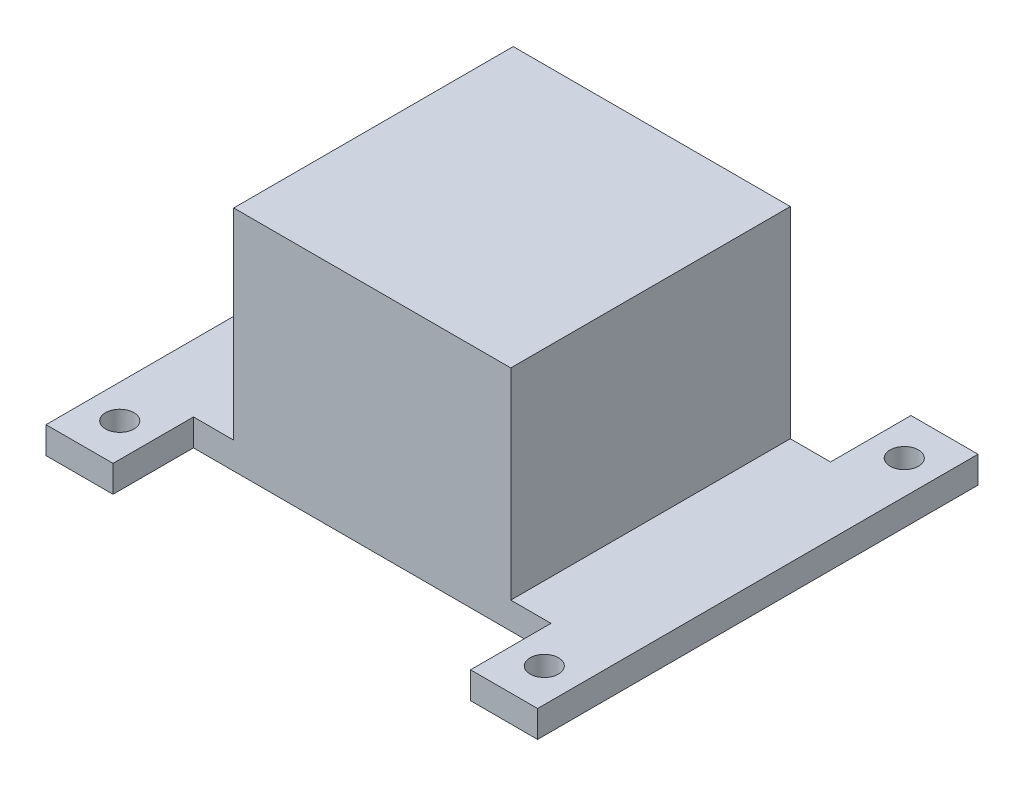
ISO-10303-21;
HEADER;
FILE_DESCRIPTION(('STEP AP214'),'2;1');
FILE_NAME('part.step','',(''),(''),'','','');
FILE_SCHEMA(('AUTOMOTIVE_DESIGN { 1 0 10303 214 1 1 1 1 }'));
ENDSEC;
DATA;
#1=APPLICATION_CONTEXT('core data for automotive mechanical design processes');
#2=APPLICATION_PROTOCOL_DEFINITION('international standard','automotive_design',2000,#1);
#3=PRODUCT_CONTEXT('',#1,'mechanical');
#4=PRODUCT('Part','Part','',(#3));
#5=PRODUCT_RELATED_PRODUCT_CATEGORY('part','',(#4));
#6=PRODUCT_DEFINITION_FORMATION('','',#4);
#7=PRODUCT_DEFINITION_CONTEXT('part definition',#1,'design');
#8=PRODUCT_DEFINITION('design','',#6,#7);
#9=PRODUCT_DEFINITION_SHAPE('','',#8);
#10=(LENGTH_UNIT() NAMED_UNIT(*) SI_UNIT(.MILLI.,.METRE.));
#11=(NAMED_UNIT(*) PLANE_ANGLE_UNIT() SI_UNIT($,.RADIAN.));
#12=(NAMED_UNIT(*) SI_UNIT($,.STERADIAN.) SOLID_ANGLE_UNIT());
#13=UNCERTAINTY_MEASURE_WITH_UNIT(LENGTH_MEASURE(1.E-05),#10,'distance_accuracy_value','');
#14=(GEOMETRIC_REPRESENTATION_CONTEXT(3) GLOBAL_UNCERTAINTY_ASSIGNED_CONTEXT((#13)) GLOBAL_UNIT_ASSIGNED_CONTEXT((#10,
#11,#12)) REPRESENTATION_CONTEXT('',''));
#15=CARTESIAN_POINT('',(0.,0.,0.));
#16=DIRECTION('',(0.,0.,1.));
#17=DIRECTION('',(1.,0.,0.));
#18=AXIS2_PLACEMENT_3D('',#15,#16,#17);
#19=CARTESIAN_POINT('',(0.,6.,0.));
#20=DIRECTION('',(0.,-1.,0.));
#21=DIRECTION('',(0.,0.,-1.));
#22=AXIS2_PLACEMENT_3D('',#19,#20,#21);
#23=PLANE('',#22);
#24=CARTESIAN_POINT('',(0.,6.,-2.725));
#25=DIRECTION('',(0.,1.,0.));
#26=DIRECTION('',(0.,0.,1.));
#27=AXIS2_PLACEMENT_3D('',#24,#25,#26);
#28=CIRCLE('',#27,9.5);
#29=CARTESIAN_POINT('',(0.,6.,6.77499999999999));
#30=VERTEX_POINT('',#29);
#31=EDGE_CURVE('E313',#30,#30,#28,.T.);
#32=ORIENTED_EDGE('',*,*,#31,.F.);
#33=EDGE_LOOP('',(#32));
#34=FACE_BOUND('',#33,.T.);
#35=DIRECTION('',(-1.,0.,0.));
#36=VECTOR('',#35,1.);
#37=CARTESIAN_POINT('',(26.,6.,26.275));
#38=LINE('',#37,#36);
#39=CARTESIAN_POINT('',(26.,6.,26.275));
#40=VERTEX_POINT('',#39);
#41=CARTESIAN_POINT('',(-26.,6.,26.275));
#42=VERTEX_POINT('',#41);
#43=EDGE_CURVE('E172',#40,#42,#38,.T.);
#44=ORIENTED_EDGE('',*,*,#43,.F.);
#45=DIRECTION('',(0.,0.,1.));
#46=VECTOR('',#45,1.);
#47=CARTESIAN_POINT('',(26.,6.,31.275));
#48=LINE('',#47,#46);
#49=CARTESIAN_POINT('',(26.,6.,-31.275));
#50=VERTEX_POINT('',#49);
#51=EDGE_CURVE('E183',#50,#40,#48,.T.);
#52=ORIENTED_EDGE('',*,*,#51,.F.);
#53=DIRECTION('',(-1.,0.,0.));
#54=VECTOR('',#53,1.);
#55=CARTESIAN_POINT('',(-55.,6.,-31.275));
#56=LINE('',#55,#54);
#57=CARTESIAN_POINT('',(-26.,6.,-31.275));
#58=VERTEX_POINT('',#57);
#59=EDGE_CURVE('E326',#50,#58,#56,.T.);
#60=ORIENTED_EDGE('',*,*,#59,.T.);
#61=DIRECTION('',(0.,0.,-1.));
#62=VECTOR('',#61,1.);
#63=CARTESIAN_POINT('',(-26.,6.,31.275));
#64=LINE('',#63,#62);
#65=EDGE_CURVE('E185',#42,#58,#64,.T.);
#66=ORIENTED_EDGE('',*,*,#65,.F.);
#67=EDGE_LOOP('',(#44,#52,#60,#66));
#68=FACE_BOUND('',#67,.T.);
#69=ADVANCED_FACE('F33',(#34,#68),#23,.F.);
#70=CARTESIAN_POINT('',(-26.,46.,31.275));
#71=DIRECTION('',(-1.,0.,0.));
#72=DIRECTION('',(0.,0.,1.));
#73=AXIS2_PLACEMENT_3D('',#70,#71,#72);
#74=PLANE('',#73);
#75=DIRECTION('',(0.,-1.,0.));
#76=VECTOR('',#75,1.);
#77=CARTESIAN_POINT('',(-26.,51.002,26.275));
#78=LINE('',#77,#76);
#79=CARTESIAN_POINT('',(-26.,46.,26.275));
#80=VERTEX_POINT('',#79);
#81=EDGE_CURVE('E50',#80,#42,#78,.T.);
#82=ORIENTED_EDGE('',*,*,#81,.T.);
#83=ORIENTED_EDGE('',*,*,#65,.T.);
#84=DIRECTION('',(0.,-1.,0.));
#85=VECTOR('',#84,1.);
#86=CARTESIAN_POINT('',(-26.,46.,-31.275));
#87=LINE('',#86,#85);
#88=CARTESIAN_POINT('',(-26.,46.,-31.275));
#89=VERTEX_POINT('',#88);
#90=EDGE_CURVE('E211',#89,#58,#87,.T.);
#91=ORIENTED_EDGE('',*,*,#90,.F.);
#92=DIRECTION('',(0.,0.,-1.));
#93=VECTOR('',#92,1.);
#94=CARTESIAN_POINT('',(-26.,46.,31.275));
#95=LINE('',#94,#93);
#96=EDGE_CURVE('E203',#80,#89,#95,.T.);
#97=ORIENTED_EDGE('',*,*,#96,.F.);
#98=EDGE_LOOP('',(#82,#83,#91,#97));
#99=FACE_BOUND('',#98,.T.);
#100=ADVANCED_FACE('F390',(#99),#74,.F.);
#101=CARTESIAN_POINT('',(26.,46.,31.275));
#102=DIRECTION('',(1.,0.,0.));
#103=DIRECTION('',(0.,0.,-1.));
#104=AXIS2_PLACEMENT_3D('',#101,#102,#103);
#105=PLANE('',#104);
#106=DIRECTION('',(0.,-1.,0.));
#107=VECTOR('',#106,1.);
#108=CARTESIAN_POINT('',(26.,51.002,26.275));
#109=LINE('',#108,#107);
#110=CARTESIAN_POINT('',(26.,46.,26.275));
#111=VERTEX_POINT('',#110);
#112=EDGE_CURVE('E169',#111,#40,#109,.T.);
#113=ORIENTED_EDGE('',*,*,#112,.F.);
#114=DIRECTION('',(0.,0.,1.));
#115=VECTOR('',#114,1.);
#116=CARTESIAN_POINT('',(26.,46.,31.275));
#117=LINE('',#116,#115);
#118=CARTESIAN_POINT('',(26.,46.,-31.275));
#119=VERTEX_POINT('',#118);
#120=EDGE_CURVE('E189',#119,#111,#117,.T.);
#121=ORIENTED_EDGE('',*,*,#120,.F.);
#122=DIRECTION('',(0.,-1.,0.));
#123=VECTOR('',#122,1.);
#124=CARTESIAN_POINT('',(26.,46.,-31.275));
#125=LINE('',#124,#123);
#126=EDGE_CURVE('E188',#119,#50,#125,.T.);
#127=ORIENTED_EDGE('',*,*,#126,.T.);
#128=ORIENTED_EDGE('',*,*,#51,.T.);
#129=EDGE_LOOP('',(#113,#121,#127,#128));
#130=FACE_BOUND('',#129,.T.);
#131=ADVANCED_FACE('F187',(#130),#105,.F.);
#132=CARTESIAN_POINT('',(-93.7495219105293,46.,31.275));
#133=DIRECTION('',(0.,-1.,0.));
#134=DIRECTION('',(0.,0.,-1.));
#135=AXIS2_PLACEMENT_3D('',#132,#133,#134);
#136=PLANE('',#135);
#137=ORIENTED_EDGE('',*,*,#120,.T.);
#138=DIRECTION('',(1.,0.,0.));
#139=VECTOR('',#138,1.);
#140=CARTESIAN_POINT('',(26.,46.,26.275));
#141=LINE('',#140,#139);
#142=EDGE_CURVE('E173',#80,#111,#141,.T.);
#143=ORIENTED_EDGE('',*,*,#142,.F.);
#144=ORIENTED_EDGE('',*,*,#96,.T.);
#145=DIRECTION('',(1.,0.,0.));
#146=VECTOR('',#145,1.);
#147=CARTESIAN_POINT('',(-93.7495219105293,46.,-31.275));
#148=LINE('',#147,#146);
#149=EDGE_CURVE('E380',#89,#119,#148,.T.);
#150=ORIENTED_EDGE('',*,*,#149,.T.);
#151=EDGE_LOOP('',(#137,#143,#144,#150));
#152=FACE_BOUND('',#151,.T.);
#153=ADVANCED_FACE('F394',(#152),#136,.T.);
#154=CARTESIAN_POINT('',(47.5,6.,-40.275));
#155=DIRECTION('',(0.,-1.,0.));
#156=DIRECTION('',(0.,0.,1.));
#157=AXIS2_PLACEMENT_3D('',#154,#155,#156);
#158=CIRCLE('',#157,3.175);
#159=CARTESIAN_POINT('',(47.5,6.,-37.1));
#160=VERTEX_POINT('',#159);
#161=EDGE_CURVE('E217',#160,#160,#158,.T.);
#162=ORIENTED_EDGE('',*,*,#161,.T.);
#163=EDGE_LOOP('',(#162));
#164=FACE_BOUND('',#163,.T.);
#165=CARTESIAN_POINT('',(47.5,6.,40.275));
#166=DIRECTION('',(0.,1.,0.));
#167=DIRECTION('',(0.,0.,-1.));
#168=AXIS2_PLACEMENT_3D('',#165,#166,#167);
#169=CIRCLE('',#168,3.175);
#170=CARTESIAN_POINT('',(47.5,6.,37.1));
#171=VERTEX_POINT('',#170);
#172=EDGE_CURVE('E266',#171,#171,#169,.T.);
#173=ORIENTED_EDGE('',*,*,#172,.F.);
#174=EDGE_LOOP('',(#173));
#175=FACE_BOUND('',#174,.T.);
#176=DIRECTION('',(0.,0.,-1.));
#177=VECTOR('',#176,1.);
#178=CARTESIAN_POINT('',(31.,6.,31.275));
#179=LINE('',#178,#177);
#180=CARTESIAN_POINT('',(31.,6.,31.275));
#181=VERTEX_POINT('',#180);
#182=CARTESIAN_POINT('',(31.,6.,-31.275));
#183=VERTEX_POINT('',#182);
#184=EDGE_CURVE('E58',#181,#183,#179,.T.);
#185=ORIENTED_EDGE('',*,*,#184,.F.);
#186=DIRECTION('',(1.,0.,0.));
#187=VECTOR('',#186,1.);
#188=CARTESIAN_POINT('',(-55.,6.,31.275));
#189=LINE('',#188,#187);
#190=CARTESIAN_POINT('',(40.,6.,31.275));
#191=VERTEX_POINT('',#190);
#192=EDGE_CURVE('E42',#181,#191,#189,.T.);
#193=ORIENTED_EDGE('',*,*,#192,.T.);
#194=DIRECTION('',(0.,0.,-1.));
#195=VECTOR('',#194,1.);
#196=CARTESIAN_POINT('',(40.,6.,49.275));
#197=LINE('',#196,#195);
#198=CARTESIAN_POINT('',(40.,6.,49.275));
#199=VERTEX_POINT('',#198);
#200=EDGE_CURVE('E290',#199,#191,#197,.T.);
#201=ORIENTED_EDGE('',*,*,#200,.F.);
#202=DIRECTION('',(-1.,0.,0.));
#203=VECTOR('',#202,1.);
#204=CARTESIAN_POINT('',(55.,6.,49.275));
#205=LINE('',#204,#203);
#206=CARTESIAN_POINT('',(55.,6.,49.275));
#207=VERTEX_POINT('',#206);
#208=EDGE_CURVE('E276',#207,#199,#205,.T.);
#209=ORIENTED_EDGE('',*,*,#208,.F.);
#210=DIRECTION('',(0.,0.,-1.));
#211=VECTOR('',#210,1.);
#212=CARTESIAN_POINT('',(55.,6.,31.275));
#213=LINE('',#212,#211);
#214=CARTESIAN_POINT('',(55.,6.,-49.275));
#215=VERTEX_POINT('',#214);
#216=EDGE_CURVE('E319',#207,#215,#213,.T.);
#217=ORIENTED_EDGE('',*,*,#216,.T.);
#218=DIRECTION('',(-1.,0.,0.));
#219=VECTOR('',#218,1.);
#220=CARTESIAN_POINT('',(55.,6.,-49.275));
#221=LINE('',#220,#219);
#222=CARTESIAN_POINT('',(40.,6.,-49.275));
#223=VERTEX_POINT('',#222);
#224=EDGE_CURVE('E234',#215,#223,#221,.T.);
#225=ORIENTED_EDGE('',*,*,#224,.T.);
#226=DIRECTION('',(0.,0.,1.));
#227=VECTOR('',#226,1.);
#228=CARTESIAN_POINT('',(40.,6.,-49.275));
#229=LINE('',#228,#227);
#230=CARTESIAN_POINT('',(40.,6.,-31.275));
#231=VERTEX_POINT('',#230);
#232=EDGE_CURVE('E237',#223,#231,#229,.T.);
#233=ORIENTED_EDGE('',*,*,#232,.T.);
#234=EDGE_CURVE('E323',#231,#183,#56,.T.);
#235=ORIENTED_EDGE('',*,*,#234,.T.);
#236=EDGE_LOOP('',(#185,#193,#201,#209,#217,#225,#233,#235));
#237=FACE_BOUND('',#236,.T.);
#238=ADVANCED_FACE('F357',(#164,#175,#237),#23,.F.);
#239=CARTESIAN_POINT('',(-47.5,6.,40.275));
#240=DIRECTION('',(0.,1.,0.));
#241=DIRECTION('',(0.,0.,1.));
#242=AXIS2_PLACEMENT_3D('',#239,#240,#241);
#243=CIRCLE('',#242,3.175);
#244=CARTESIAN_POINT('',(-47.5,6.,43.45));
#245=VERTEX_POINT('',#244);
#246=EDGE_CURVE('E267',#245,#245,#243,.T.);
#247=ORIENTED_EDGE('',*,*,#246,.F.);
#248=EDGE_LOOP('',(#247));
#249=FACE_BOUND('',#248,.T.);
#250=CARTESIAN_POINT('',(-47.5,6.,-40.275));
#251=DIRECTION('',(0.,-1.,0.));
#252=DIRECTION('',(0.,0.,-1.));
#253=AXIS2_PLACEMENT_3D('',#250,#251,#252);
#254=CIRCLE('',#253,3.175);
#255=CARTESIAN_POINT('',(-47.5,6.,-43.45));
#256=VERTEX_POINT('',#255);
#257=EDGE_CURVE('E218',#256,#256,#254,.T.);
#258=ORIENTED_EDGE('',*,*,#257,.T.);
#259=EDGE_LOOP('',(#258));
#260=FACE_BOUND('',#259,.T.);
#261=DIRECTION('',(0.,0.,1.));
#262=VECTOR('',#261,1.);
#263=CARTESIAN_POINT('',(-31.,6.,31.275));
#264=LINE('',#263,#262);
#265=CARTESIAN_POINT('',(-31.,6.,-31.275));
#266=VERTEX_POINT('',#265);
#267=CARTESIAN_POINT('',(-31.,6.,31.275));
#268=VERTEX_POINT('',#267);
#269=EDGE_CURVE('E202',#266,#268,#264,.T.);
#270=ORIENTED_EDGE('',*,*,#269,.F.);
#271=CARTESIAN_POINT('',(-40.,6.,-31.275));
#272=VERTEX_POINT('',#271);
#273=EDGE_CURVE('E321',#266,#272,#56,.T.);
#274=ORIENTED_EDGE('',*,*,#273,.T.);
#275=DIRECTION('',(0.,0.,1.));
#276=VECTOR('',#275,1.);
#277=CARTESIAN_POINT('',(-40.,6.,-49.275));
#278=LINE('',#277,#276);
#279=CARTESIAN_POINT('',(-40.,6.,-49.275));
#280=VERTEX_POINT('',#279);
#281=EDGE_CURVE('E263',#280,#272,#278,.T.);
#282=ORIENTED_EDGE('',*,*,#281,.F.);
#283=DIRECTION('',(-1.,0.,0.));
#284=VECTOR('',#283,1.);
#285=CARTESIAN_POINT('',(-55.,6.,-49.275));
#286=LINE('',#285,#284);
#287=CARTESIAN_POINT('',(-55.,6.,-49.275));
#288=VERTEX_POINT('',#287);
#289=EDGE_CURVE('E249',#280,#288,#286,.T.);
#290=ORIENTED_EDGE('',*,*,#289,.T.);
#291=DIRECTION('',(0.,0.,1.));
#292=VECTOR('',#291,1.);
#293=CARTESIAN_POINT('',(-55.,6.,31.275));
#294=LINE('',#293,#292);
#295=CARTESIAN_POINT('',(-55.,6.,49.275));
#296=VERTEX_POINT('',#295);
#297=EDGE_CURVE('E325',#288,#296,#294,.T.);
#298=ORIENTED_EDGE('',*,*,#297,.T.);
#299=DIRECTION('',(-1.,0.,0.));
#300=VECTOR('',#299,1.);
#301=CARTESIAN_POINT('',(-55.,6.,49.275));
#302=LINE('',#301,#300);
#303=CARTESIAN_POINT('',(-40.,6.,49.275));
#304=VERTEX_POINT('',#303);
#305=EDGE_CURVE('E301',#304,#296,#302,.T.);
#306=ORIENTED_EDGE('',*,*,#305,.F.);
#307=DIRECTION('',(0.,0.,-1.));
#308=VECTOR('',#307,1.);
#309=CARTESIAN_POINT('',(-40.,6.,49.275));
#310=LINE('',#309,#308);
#311=CARTESIAN_POINT('',(-40.,6.,31.275));
#312=VERTEX_POINT('',#311);
#313=EDGE_CURVE('E304',#304,#312,#310,.T.);
#314=ORIENTED_EDGE('',*,*,#313,.T.);
#315=EDGE_CURVE('E11',#312,#268,#189,.T.);
#316=ORIENTED_EDGE('',*,*,#315,.T.);
#317=EDGE_LOOP('',(#270,#274,#282,#290,#298,#306,#314,#316));
#318=FACE_BOUND('',#317,.T.);
#319=ADVANCED_FACE('F353',(#249,#260,#318),#23,.F.);
#320=CARTESIAN_POINT('',(-55.,6.,31.275));
#321=DIRECTION('',(0.,0.,-1.));
#322=DIRECTION('',(-1.,0.,0.));
#323=AXIS2_PLACEMENT_3D('',#320,#321,#322);
#324=PLANE('',#323);
#325=DIRECTION('',(0.,-1.,0.));
#326=VECTOR('',#325,1.);
#327=CARTESIAN_POINT('',(40.,0.,31.275));
#328=LINE('',#327,#326);
#329=CARTESIAN_POINT('',(40.,0.,31.275));
#330=VERTEX_POINT('',#329);
#331=EDGE_CURVE('E277',#191,#330,#328,.T.);
#332=ORIENTED_EDGE('',*,*,#331,.F.);
#333=ORIENTED_EDGE('',*,*,#192,.F.);
#334=DIRECTION('',(0.,-1.,0.));
#335=VECTOR('',#334,1.);
#336=CARTESIAN_POINT('',(31.,46.,31.275));
#337=LINE('',#336,#335);
#338=CARTESIAN_POINT('',(31.,51.,31.275));
#339=VERTEX_POINT('',#338);
#340=EDGE_CURVE('E191',#339,#181,#337,.T.);
#341=ORIENTED_EDGE('',*,*,#340,.F.);
#342=DIRECTION('',(1.,0.,0.));
#343=VECTOR('',#342,1.);
#344=CARTESIAN_POINT('',(-93.7495219105293,51.,31.275));
#345=LINE('',#344,#343);
#346=CARTESIAN_POINT('',(-31.,51.,31.275));
#347=VERTEX_POINT('',#346);
#348=EDGE_CURVE('E373',#347,#339,#345,.T.);
#349=ORIENTED_EDGE('',*,*,#348,.F.);
#350=DIRECTION('',(0.,-1.,0.));
#351=VECTOR('',#350,1.);
#352=CARTESIAN_POINT('',(-31.,46.,31.275));
#353=LINE('',#352,#351);
#354=EDGE_CURVE('E214',#347,#268,#353,.T.);
#355=ORIENTED_EDGE('',*,*,#354,.T.);
#356=ORIENTED_EDGE('',*,*,#315,.F.);
#357=DIRECTION('',(0.,1.,0.));
#358=VECTOR('',#357,1.);
#359=CARTESIAN_POINT('',(-40.,0.,31.275));
#360=LINE('',#359,#358);
#361=CARTESIAN_POINT('',(-40.,0.,31.275));
#362=VERTEX_POINT('',#361);
#363=EDGE_CURVE('E293',#362,#312,#360,.T.);
#364=ORIENTED_EDGE('',*,*,#363,.F.);
#365=DIRECTION('',(1.,0.,0.));
#366=VECTOR('',#365,1.);
#367=CARTESIAN_POINT('',(-55.,0.,31.275));
#368=LINE('',#367,#366);
#369=EDGE_CURVE('E322',#362,#330,#368,.T.);
#370=ORIENTED_EDGE('',*,*,#369,.T.);
#371=EDGE_LOOP('',(#332,#333,#341,#349,#355,#356,#364,#370));
#372=FACE_BOUND('',#371,.T.);
#373=ADVANCED_FACE('F356',(#372),#324,.F.);
#374=CARTESIAN_POINT('',(55.,6.,31.275));
#375=DIRECTION('',(-1.,0.,0.));
#376=DIRECTION('',(0.,0.,1.));
#377=AXIS2_PLACEMENT_3D('',#374,#375,#376);
#378=PLANE('',#377);
#379=DIRECTION('',(0.,0.,-1.));
#380=VECTOR('',#379,1.);
#381=CARTESIAN_POINT('',(55.,0.,31.275));
#382=LINE('',#381,#380);
#383=CARTESIAN_POINT('',(55.,0.,49.275));
#384=VERTEX_POINT('',#383);
#385=CARTESIAN_POINT('',(55.,0.,-49.275));
#386=VERTEX_POINT('',#385);
#387=EDGE_CURVE('E316',#384,#386,#382,.T.);
#388=ORIENTED_EDGE('',*,*,#387,.T.);
#389=DIRECTION('',(0.,1.,0.));
#390=VECTOR('',#389,1.);
#391=CARTESIAN_POINT('',(55.,0.,-49.275));
#392=LINE('',#391,#390);
#393=EDGE_CURVE('E224',#386,#215,#392,.T.);
#394=ORIENTED_EDGE('',*,*,#393,.T.);
#395=ORIENTED_EDGE('',*,*,#216,.F.);
#396=DIRECTION('',(0.,1.,0.));
#397=VECTOR('',#396,1.);
#398=CARTESIAN_POINT('',(55.,0.,49.275));
#399=LINE('',#398,#397);
#400=EDGE_CURVE('E273',#384,#207,#399,.T.);
#401=ORIENTED_EDGE('',*,*,#400,.F.);
#402=EDGE_LOOP('',(#388,#394,#395,#401));
#403=FACE_BOUND('',#402,.T.);
#404=ADVANCED_FACE('F35',(#403),#378,.F.);
#405=CARTESIAN_POINT('',(-55.,6.,-31.275));
#406=DIRECTION('',(0.,0.,1.));
#407=DIRECTION('',(1.,0.,0.));
#408=AXIS2_PLACEMENT_3D('',#405,#406,#407);
#409=PLANE('',#408);
#410=DIRECTION('',(0.,-1.,0.));
#411=VECTOR('',#410,1.);
#412=CARTESIAN_POINT('',(-31.,46.,-31.275));
#413=LINE('',#412,#411);
#414=CARTESIAN_POINT('',(-31.,51.,-31.275));
#415=VERTEX_POINT('',#414);
#416=EDGE_CURVE('E205',#415,#266,#413,.T.);
#417=ORIENTED_EDGE('',*,*,#416,.F.);
#418=DIRECTION('',(1.,0.,0.));
#419=VECTOR('',#418,1.);
#420=CARTESIAN_POINT('',(-93.7495219105293,51.,-31.275));
#421=LINE('',#420,#419);
#422=CARTESIAN_POINT('',(31.,51.,-31.275));
#423=VERTEX_POINT('',#422);
#424=EDGE_CURVE('E376',#415,#423,#421,.T.);
#425=ORIENTED_EDGE('',*,*,#424,.T.);
#426=DIRECTION('',(0.,-1.,0.));
#427=VECTOR('',#426,1.);
#428=CARTESIAN_POINT('',(31.,46.,-31.275));
#429=LINE('',#428,#427);
#430=EDGE_CURVE('E199',#423,#183,#429,.T.);
#431=ORIENTED_EDGE('',*,*,#430,.T.);
#432=ORIENTED_EDGE('',*,*,#234,.F.);
#433=DIRECTION('',(0.,-1.,0.));
#434=VECTOR('',#433,1.);
#435=CARTESIAN_POINT('',(40.,0.,-31.275));
#436=LINE('',#435,#434);
#437=CARTESIAN_POINT('',(40.,0.,-31.275));
#438=VERTEX_POINT('',#437);
#439=EDGE_CURVE('E228',#231,#438,#436,.T.);
#440=ORIENTED_EDGE('',*,*,#439,.T.);
#441=DIRECTION('',(-1.,0.,0.));
#442=VECTOR('',#441,1.);
#443=CARTESIAN_POINT('',(-55.,0.,-31.275));
#444=LINE('',#443,#442);
#445=CARTESIAN_POINT('',(-40.,0.,-31.275));
#446=VERTEX_POINT('',#445);
#447=EDGE_CURVE('E329',#438,#446,#444,.T.);
#448=ORIENTED_EDGE('',*,*,#447,.T.);
#449=DIRECTION('',(0.,1.,0.));
#450=VECTOR('',#449,1.);
#451=CARTESIAN_POINT('',(-40.,0.,-31.275));
#452=LINE('',#451,#450);
#453=EDGE_CURVE('E245',#446,#272,#452,.T.);
#454=ORIENTED_EDGE('',*,*,#453,.T.);
#455=ORIENTED_EDGE('',*,*,#273,.F.);
#456=EDGE_LOOP('',(#417,#425,#431,#432,#440,#448,#454,#455));
#457=FACE_BOUND('',#456,.T.);
#458=ORIENTED_EDGE('',*,*,#149,.F.);
#459=ORIENTED_EDGE('',*,*,#90,.T.);
#460=ORIENTED_EDGE('',*,*,#59,.F.);
#461=ORIENTED_EDGE('',*,*,#126,.F.);
#462=EDGE_LOOP('',(#458,#459,#460,#461));
#463=FACE_BOUND('',#462,.T.);
#464=ADVANCED_FACE('F363',(#457,#463),#409,.F.);
#465=CARTESIAN_POINT('',(-55.,6.,31.275));
#466=DIRECTION('',(1.,0.,0.));
#467=DIRECTION('',(0.,0.,-1.));
#468=AXIS2_PLACEMENT_3D('',#465,#466,#467);
#469=PLANE('',#468);
#470=DIRECTION('',(0.,0.,1.));
#471=VECTOR('',#470,1.);
#472=CARTESIAN_POINT('',(-55.,0.,31.275));
#473=LINE('',#472,#471);
#474=CARTESIAN_POINT('',(-55.,0.,-49.275));
#475=VERTEX_POINT('',#474);
#476=CARTESIAN_POINT('',(-55.,0.,49.275));
#477=VERTEX_POINT('',#476);
#478=EDGE_CURVE('E331',#475,#477,#473,.T.);
#479=ORIENTED_EDGE('',*,*,#478,.T.);
#480=DIRECTION('',(0.,-1.,0.));
#481=VECTOR('',#480,1.);
#482=CARTESIAN_POINT('',(-55.,0.,49.275));
#483=LINE('',#482,#481);
#484=EDGE_CURVE('E294',#296,#477,#483,.T.);
#485=ORIENTED_EDGE('',*,*,#484,.F.);
#486=ORIENTED_EDGE('',*,*,#297,.F.);
#487=DIRECTION('',(0.,-1.,0.));
#488=VECTOR('',#487,1.);
#489=CARTESIAN_POINT('',(-55.,0.,-49.275));
#490=LINE('',#489,#488);
#491=EDGE_CURVE('E246',#288,#475,#490,.T.);
#492=ORIENTED_EDGE('',*,*,#491,.T.);
#493=EDGE_LOOP('',(#479,#485,#486,#492));
#494=FACE_BOUND('',#493,.T.);
#495=ADVANCED_FACE('F396',(#494),#469,.F.);
#496=CARTESIAN_POINT('',(0.,0.,0.));
#497=DIRECTION('',(0.,-1.,0.));
#498=DIRECTION('',(0.,0.,-1.));
#499=AXIS2_PLACEMENT_3D('',#496,#497,#498);
#500=PLANE('',#499);
#501=CARTESIAN_POINT('',(-47.5,0.,-40.275));
#502=DIRECTION('',(0.,-1.,0.));
#503=DIRECTION('',(0.,0.,-1.));
#504=AXIS2_PLACEMENT_3D('',#501,#502,#503);
#505=CIRCLE('',#504,3.175);
#506=CARTESIAN_POINT('',(-47.5,0.,-43.45));
#507=VERTEX_POINT('',#506);
#508=EDGE_CURVE('E37',#507,#507,#505,.F.);
#509=ORIENTED_EDGE('',*,*,#508,.T.);
#510=EDGE_LOOP('',(#509));
#511=FACE_BOUND('',#510,.T.);
#512=CARTESIAN_POINT('',(47.5,0.,-40.275));
#513=DIRECTION('',(0.,-1.,0.));
#514=DIRECTION('',(0.,0.,-1.));
#515=AXIS2_PLACEMENT_3D('',#512,#513,#514);
#516=CIRCLE('',#515,3.175);
#517=CARTESIAN_POINT('',(47.5,0.,-43.45));
#518=VERTEX_POINT('',#517);
#519=EDGE_CURVE('E221',#518,#518,#516,.F.);
#520=ORIENTED_EDGE('',*,*,#519,.T.);
#521=EDGE_LOOP('',(#520));
#522=FACE_BOUND('',#521,.T.);
#523=CARTESIAN_POINT('',(-47.5,0.,40.275));
#524=DIRECTION('',(0.,-1.,0.));
#525=DIRECTION('',(0.,0.,-1.));
#526=AXIS2_PLACEMENT_3D('',#523,#524,#525);
#527=CIRCLE('',#526,3.175);
#528=CARTESIAN_POINT('',(-47.5,0.,37.1));
#529=VERTEX_POINT('',#528);
#530=EDGE_CURVE('E287',#529,#529,#527,.T.);
#531=ORIENTED_EDGE('',*,*,#530,.F.);
#532=EDGE_LOOP('',(#531));
#533=FACE_BOUND('',#532,.T.);
#534=CARTESIAN_POINT('',(47.5,0.,40.275));
#535=DIRECTION('',(0.,-1.,0.));
#536=DIRECTION('',(0.,0.,-1.));
#537=AXIS2_PLACEMENT_3D('',#534,#535,#536);
#538=CIRCLE('',#537,3.175);
#539=CARTESIAN_POINT('',(47.5,0.,37.1));
#540=VERTEX_POINT('',#539);
#541=EDGE_CURVE('E270',#540,#540,#538,.T.);
#542=ORIENTED_EDGE('',*,*,#541,.F.);
#543=EDGE_LOOP('',(#542));
#544=FACE_BOUND('',#543,.T.);
#545=CARTESIAN_POINT('',(0.,0.,-2.725));
#546=DIRECTION('',(0.,-1.,0.));
#547=DIRECTION('',(0.,0.,-1.));
#548=AXIS2_PLACEMENT_3D('',#545,#546,#547);
#549=CIRCLE('',#548,9.5);
#550=CARTESIAN_POINT('',(0.,0.,6.77499999999999));
#551=VERTEX_POINT('',#550);
#552=EDGE_CURVE('E312',#551,#551,#549,.F.);
#553=ORIENTED_EDGE('',*,*,#552,.T.);
#554=EDGE_LOOP('',(#553));
#555=FACE_BOUND('',#554,.T.);
#556=ORIENTED_EDGE('',*,*,#387,.F.);
#557=DIRECTION('',(1.,0.,0.));
#558=VECTOR('',#557,1.);
#559=CARTESIAN_POINT('',(55.,0.,49.275));
#560=LINE('',#559,#558);
#561=CARTESIAN_POINT('',(40.,0.,49.275));
#562=VERTEX_POINT('',#561);
#563=EDGE_CURVE('E281',#562,#384,#560,.T.);
#564=ORIENTED_EDGE('',*,*,#563,.F.);
#565=DIRECTION('',(0.,0.,-1.));
#566=VECTOR('',#565,1.);
#567=CARTESIAN_POINT('',(40.,0.,49.275));
#568=LINE('',#567,#566);
#569=EDGE_CURVE('E284',#562,#330,#568,.T.);
#570=ORIENTED_EDGE('',*,*,#569,.T.);
#571=ORIENTED_EDGE('',*,*,#369,.F.);
#572=DIRECTION('',(0.,0.,-1.));
#573=VECTOR('',#572,1.);
#574=CARTESIAN_POINT('',(-40.,0.,49.275));
#575=LINE('',#574,#573);
#576=CARTESIAN_POINT('',(-40.,0.,49.275));
#577=VERTEX_POINT('',#576);
#578=EDGE_CURVE('E309',#577,#362,#575,.T.);
#579=ORIENTED_EDGE('',*,*,#578,.F.);
#580=DIRECTION('',(1.,0.,0.));
#581=VECTOR('',#580,1.);
#582=CARTESIAN_POINT('',(-55.,0.,49.275));
#583=LINE('',#582,#581);
#584=EDGE_CURVE('E297',#477,#577,#583,.T.);
#585=ORIENTED_EDGE('',*,*,#584,.F.);
#586=ORIENTED_EDGE('',*,*,#478,.F.);
#587=DIRECTION('',(1.,0.,0.));
#588=VECTOR('',#587,1.);
#589=CARTESIAN_POINT('',(-55.,0.,-49.275));
#590=LINE('',#589,#588);
#591=CARTESIAN_POINT('',(-40.,0.,-49.275));
#592=VERTEX_POINT('',#591);
#593=EDGE_CURVE('E255',#475,#592,#590,.T.);
#594=ORIENTED_EDGE('',*,*,#593,.T.);
#595=DIRECTION('',(0.,0.,1.));
#596=VECTOR('',#595,1.);
#597=CARTESIAN_POINT('',(-40.,0.,-49.275));
#598=LINE('',#597,#596);
#599=EDGE_CURVE('E258',#592,#446,#598,.T.);
#600=ORIENTED_EDGE('',*,*,#599,.T.);
#601=ORIENTED_EDGE('',*,*,#447,.F.);
#602=DIRECTION('',(0.,0.,1.));
#603=VECTOR('',#602,1.);
#604=CARTESIAN_POINT('',(40.,0.,-49.275));
#605=LINE('',#604,#603);
#606=CARTESIAN_POINT('',(40.,0.,-49.275));
#607=VERTEX_POINT('',#606);
#608=EDGE_CURVE('E242',#607,#438,#605,.T.);
#609=ORIENTED_EDGE('',*,*,#608,.F.);
#610=DIRECTION('',(1.,0.,0.));
#611=VECTOR('',#610,1.);
#612=CARTESIAN_POINT('',(55.,0.,-49.275));
#613=LINE('',#612,#611);
#614=EDGE_CURVE('E227',#607,#386,#613,.T.);
#615=ORIENTED_EDGE('',*,*,#614,.T.);
#616=EDGE_LOOP('',(#556,#564,#570,#571,#579,#585,#586,#594,#600,#601,#609,#615));
#617=FACE_BOUND('',#616,.T.);
#618=ADVANCED_FACE('F343',(#511,#522,#533,#544,#555,#617),#500,.T.);
#619=CARTESIAN_POINT('',(0.,-0.00100000000000013,-2.725));
#620=DIRECTION('',(0.,1.,0.));
#621=DIRECTION('',(0.,0.,1.));
#622=AXIS2_PLACEMENT_3D('',#619,#620,#621);
#623=CYLINDRICAL_SURFACE('',#622,9.5);
#624=CARTESIAN_POINT('',(0.,0.,6.77499999999999));
#625=CARTESIAN_POINT('',(0.,0.0624999999999999,6.77499999999999));
#626=CARTESIAN_POINT('',(0.,0.125,6.77499999999999));
#627=CARTESIAN_POINT('',(0.,0.25,6.77499999999999));
#628=CARTESIAN_POINT('',(0.,0.3125,6.77499999999999));
#629=CARTESIAN_POINT('',(0.,0.4375,6.77499999999999));
#630=CARTESIAN_POINT('',(0.,0.5,6.77499999999999));
#631=CARTESIAN_POINT('',(0.,0.625,6.77499999999999));
#632=CARTESIAN_POINT('',(0.,0.6875,6.77499999999999));
#633=CARTESIAN_POINT('',(0.,0.8125,6.77499999999999));
#634=CARTESIAN_POINT('',(0.,0.875,6.77499999999999));
#635=CARTESIAN_POINT('',(0.,1.,6.77499999999999));
#636=CARTESIAN_POINT('',(0.,1.0625,6.77499999999999));
#637=CARTESIAN_POINT('',(0.,1.1875,6.77499999999999));
#638=CARTESIAN_POINT('',(0.,1.25,6.77499999999999));
#639=CARTESIAN_POINT('',(0.,1.375,6.77499999999999));
#640=CARTESIAN_POINT('',(0.,1.4375,6.77499999999999));
#641=CARTESIAN_POINT('',(0.,1.5625,6.77499999999999));
#642=CARTESIAN_POINT('',(0.,1.625,6.77499999999999));
#643=CARTESIAN_POINT('',(0.,1.75,6.77499999999999));
#644=CARTESIAN_POINT('',(0.,1.8125,6.77499999999999));
#645=CARTESIAN_POINT('',(0.,1.9375,6.77499999999999));
#646=CARTESIAN_POINT('',(0.,2.,6.77499999999999));
#647=CARTESIAN_POINT('',(0.,2.125,6.77499999999999));
#648=CARTESIAN_POINT('',(0.,2.1875,6.77499999999999));
#649=CARTESIAN_POINT('',(0.,2.3125,6.77499999999999));
#650=CARTESIAN_POINT('',(0.,2.375,6.77499999999999));
#651=CARTESIAN_POINT('',(0.,2.5,6.77499999999999));
#652=CARTESIAN_POINT('',(0.,2.5625,6.77499999999999));
#653=CARTESIAN_POINT('',(0.,2.6875,6.77499999999999));
#654=CARTESIAN_POINT('',(0.,2.75,6.77499999999999));
#655=CARTESIAN_POINT('',(0.,2.875,6.77499999999999));
#656=CARTESIAN_POINT('',(0.,2.9375,6.77499999999999));
#657=CARTESIAN_POINT('',(0.,3.0625,6.77499999999999));
#658=CARTESIAN_POINT('',(0.,3.125,6.77499999999999));
#659=CARTESIAN_POINT('',(0.,3.25,6.77499999999999));
#660=CARTESIAN_POINT('',(0.,3.3125,6.77499999999999));
#661=CARTESIAN_POINT('',(0.,3.4375,6.77499999999999));
#662=CARTESIAN_POINT('',(0.,3.5,6.77499999999999));
#663=CARTESIAN_POINT('',(0.,3.625,6.77499999999999));
#664=CARTESIAN_POINT('',(0.,3.6875,6.77499999999999));
#665=CARTESIAN_POINT('',(0.,3.8125,6.77499999999999));
#666=CARTESIAN_POINT('',(0.,3.875,6.77499999999999));
#667=CARTESIAN_POINT('',(0.,4.,6.77499999999999));
#668=CARTESIAN_POINT('',(0.,4.0625,6.77499999999999));
#669=CARTESIAN_POINT('',(0.,4.1875,6.77499999999999));
#670=CARTESIAN_POINT('',(0.,4.25,6.77499999999999));
#671=CARTESIAN_POINT('',(0.,4.375,6.77499999999999));
#672=CARTESIAN_POINT('',(0.,4.4375,6.77499999999999));
#673=CARTESIAN_POINT('',(0.,4.5625,6.77499999999999));
#674=CARTESIAN_POINT('',(0.,4.625,6.77499999999999));
#675=CARTESIAN_POINT('',(0.,4.75,6.77499999999999));
#676=CARTESIAN_POINT('',(0.,4.8125,6.77499999999999));
#677=CARTESIAN_POINT('',(0.,4.9375,6.77499999999999));
#678=CARTESIAN_POINT('',(0.,5.,6.77499999999999));
#679=CARTESIAN_POINT('',(0.,5.125,6.77499999999999));
#680=CARTESIAN_POINT('',(0.,5.1875,6.77499999999999));
#681=CARTESIAN_POINT('',(0.,5.3125,6.77499999999999));
#682=CARTESIAN_POINT('',(0.,5.375,6.77499999999999));
#683=CARTESIAN_POINT('',(0.,5.5,6.77499999999999));
#684=CARTESIAN_POINT('',(0.,5.5625,6.77499999999999));
#685=CARTESIAN_POINT('',(0.,5.6875,6.77499999999999));
#686=CARTESIAN_POINT('',(0.,5.75,6.77499999999999));
#687=CARTESIAN_POINT('',(0.,5.875,6.77499999999999));
#688=CARTESIAN_POINT('',(0.,5.9375,6.77499999999999));
#689=CARTESIAN_POINT('',(0.,6.,6.77499999999999));
#690=B_SPLINE_CURVE_WITH_KNOTS('',3,(#624,#625,#626,#627,#628,#629,#630,#631,#632,#633,#634,
#635,#636,#637,#638,#639,#640,#641,#642,#643,#644,#645,#646,#647,#648,#649,#650,#651,#652,#653,
#654,#655,#656,#657,#658,#659,#660,#661,#662,#663,#664,#665,#666,#667,#668,#669,#670,#671,#672,
#673,#674,#675,#676,#677,#678,#679,#680,#681,#682,#683,#684,#685,#686,#687,#688,#689),
.UNSPECIFIED.,.F.,.F.,(4,2,2,2,2,2,2,2,2,2,2,2,2,2,2,2,2,2,2,2,2,2,2,2,2,2,2,2,2,2,2,2,4),(0.,
0.1875,0.375,0.5625,0.75,0.9375,1.125,1.3125,1.5,1.6875,1.875,2.0625,2.25,2.4375,2.625,2.8125,
3.,3.1875,3.375,3.5625,3.75,3.9375,4.125,4.3125,4.5,4.6875,4.875,5.0625,5.25,5.4375,5.625,
5.8125,6.),.UNSPECIFIED.);
#691=EDGE_CURVE('BSEAM450',#551,#30,#690,.T.);
#692=ORIENTED_EDGE('',*,*,#552,.F.);
#693=ORIENTED_EDGE('',*,*,#31,.T.);
#694=ORIENTED_EDGE('',*,*,#691,.T.);
#695=ORIENTED_EDGE('',*,*,#691,.F.);
#696=EDGE_LOOP('',(#692,#694,#693,#695));
#697=FACE_BOUND('',#696,.T.);
#698=ADVANCED_FACE('F450',(#697),#623,.F.);
#699=CARTESIAN_POINT('',(-40.,0.,49.275));
#700=DIRECTION('',(-1.,0.,0.));
#701=DIRECTION('',(0.,0.,1.));
#702=AXIS2_PLACEMENT_3D('',#699,#700,#701);
#703=PLANE('',#702);
#704=ORIENTED_EDGE('',*,*,#363,.T.);
#705=ORIENTED_EDGE('',*,*,#313,.F.);
#706=DIRECTION('',(0.,1.,0.));
#707=VECTOR('',#706,1.);
#708=CARTESIAN_POINT('',(-40.,0.,49.275));
#709=LINE('',#708,#707);
#710=EDGE_CURVE('E299',#577,#304,#709,.T.);
#711=ORIENTED_EDGE('',*,*,#710,.F.);
#712=ORIENTED_EDGE('',*,*,#578,.T.);
#713=EDGE_LOOP('',(#704,#705,#711,#712));
#714=FACE_BOUND('',#713,.T.);
#715=ADVANCED_FACE('F447',(#714),#703,.F.);
#716=CARTESIAN_POINT('',(0.,0.,49.275));
#717=DIRECTION('',(0.,0.,-1.));
#718=DIRECTION('',(-1.,0.,0.));
#719=AXIS2_PLACEMENT_3D('',#716,#717,#718);
#720=PLANE('',#719);
#721=ORIENTED_EDGE('',*,*,#484,.T.);
#722=ORIENTED_EDGE('',*,*,#584,.T.);
#723=ORIENTED_EDGE('',*,*,#710,.T.);
#724=ORIENTED_EDGE('',*,*,#305,.T.);
#725=EDGE_LOOP('',(#721,#722,#723,#724));
#726=FACE_BOUND('',#725,.T.);
#727=ADVANCED_FACE('F443',(#726),#720,.F.);
#728=CARTESIAN_POINT('',(40.,0.,49.275));
#729=DIRECTION('',(1.,0.,0.));
#730=DIRECTION('',(0.,0.,-1.));
#731=AXIS2_PLACEMENT_3D('',#728,#729,#730);
#732=PLANE('',#731);
#733=ORIENTED_EDGE('',*,*,#331,.T.);
#734=ORIENTED_EDGE('',*,*,#569,.F.);
#735=DIRECTION('',(0.,-1.,0.));
#736=VECTOR('',#735,1.);
#737=CARTESIAN_POINT('',(40.,0.,49.275));
#738=LINE('',#737,#736);
#739=EDGE_CURVE('E279',#199,#562,#738,.T.);
#740=ORIENTED_EDGE('',*,*,#739,.F.);
#741=ORIENTED_EDGE('',*,*,#200,.T.);
#742=EDGE_LOOP('',(#733,#734,#740,#741));
#743=FACE_BOUND('',#742,.T.);
#744=ADVANCED_FACE('F436',(#743),#732,.F.);
#745=CARTESIAN_POINT('',(0.,0.,49.275));
#746=DIRECTION('',(0.,0.,1.));
#747=DIRECTION('',(1.,0.,0.));
#748=AXIS2_PLACEMENT_3D('',#745,#746,#747);
#749=PLANE('',#748);
#750=ORIENTED_EDGE('',*,*,#400,.T.);
#751=ORIENTED_EDGE('',*,*,#208,.T.);
#752=ORIENTED_EDGE('',*,*,#739,.T.);
#753=ORIENTED_EDGE('',*,*,#563,.T.);
#754=EDGE_LOOP('',(#750,#751,#752,#753));
#755=FACE_BOUND('',#754,.T.);
#756=ADVANCED_FACE('F426',(#755),#749,.T.);
#757=CARTESIAN_POINT('',(47.5,-12.,40.275));
#758=DIRECTION('',(0.,1.,0.));
#759=DIRECTION('',(0.,0.,1.));
#760=AXIS2_PLACEMENT_3D('',#757,#758,#759);
#761=CYLINDRICAL_SURFACE('',#760,3.175);
#762=ORIENTED_EDGE('',*,*,#541,.T.);
#763=EDGE_LOOP('',(#762));
#764=FACE_BOUND('',#763,.T.);
#765=ORIENTED_EDGE('',*,*,#172,.T.);
#766=EDGE_LOOP('',(#765));
#767=FACE_BOUND('',#766,.T.);
#768=ADVANCED_FACE('F423',(#764,#767),#761,.F.);
#769=CARTESIAN_POINT('',(-47.5,-12.,40.275));
#770=DIRECTION('',(0.,1.,0.));
#771=DIRECTION('',(0.,0.,1.));
#772=AXIS2_PLACEMENT_3D('',#769,#770,#771);
#773=CYLINDRICAL_SURFACE('',#772,3.175);
#774=ORIENTED_EDGE('',*,*,#530,.T.);
#775=EDGE_LOOP('',(#774));
#776=FACE_BOUND('',#775,.T.);
#777=ORIENTED_EDGE('',*,*,#246,.T.);
#778=EDGE_LOOP('',(#777));
#779=FACE_BOUND('',#778,.T.);
#780=ADVANCED_FACE('F425',(#776,#779),#773,.F.);
#781=CARTESIAN_POINT('',(-40.,0.,-49.275));
#782=DIRECTION('',(1.,0.,0.));
#783=DIRECTION('',(0.,0.,-1.));
#784=AXIS2_PLACEMENT_3D('',#781,#782,#783);
#785=PLANE('',#784);
#786=ORIENTED_EDGE('',*,*,#453,.F.);
#787=ORIENTED_EDGE('',*,*,#599,.F.);
#788=DIRECTION('',(0.,1.,0.));
#789=VECTOR('',#788,1.);
#790=CARTESIAN_POINT('',(-40.,0.,-49.275));
#791=LINE('',#790,#789);
#792=EDGE_CURVE('E252',#592,#280,#791,.T.);
#793=ORIENTED_EDGE('',*,*,#792,.T.);
#794=ORIENTED_EDGE('',*,*,#281,.T.);
#795=EDGE_LOOP('',(#786,#787,#793,#794));
#796=FACE_BOUND('',#795,.T.);
#797=ADVANCED_FACE('F433',(#796),#785,.T.);
#798=CARTESIAN_POINT('',(0.,0.,-49.275));
#799=DIRECTION('',(0.,0.,1.));
#800=DIRECTION('',(-1.,0.,0.));
#801=AXIS2_PLACEMENT_3D('',#798,#799,#800);
#802=PLANE('',#801);
#803=ORIENTED_EDGE('',*,*,#491,.F.);
#804=ORIENTED_EDGE('',*,*,#289,.F.);
#805=ORIENTED_EDGE('',*,*,#792,.F.);
#806=ORIENTED_EDGE('',*,*,#593,.F.);
#807=EDGE_LOOP('',(#803,#804,#805,#806));
#808=FACE_BOUND('',#807,.T.);
#809=ADVANCED_FACE('F484',(#808),#802,.F.);
#810=CARTESIAN_POINT('',(40.,0.,-49.275));
#811=DIRECTION('',(-1.,0.,0.));
#812=DIRECTION('',(0.,0.,1.));
#813=AXIS2_PLACEMENT_3D('',#810,#811,#812);
#814=PLANE('',#813);
#815=ORIENTED_EDGE('',*,*,#439,.F.);
#816=ORIENTED_EDGE('',*,*,#232,.F.);
#817=DIRECTION('',(0.,-1.,0.));
#818=VECTOR('',#817,1.);
#819=CARTESIAN_POINT('',(40.,0.,-49.275));
#820=LINE('',#819,#818);
#821=EDGE_CURVE('E231',#223,#607,#820,.T.);
#822=ORIENTED_EDGE('',*,*,#821,.T.);
#823=ORIENTED_EDGE('',*,*,#608,.T.);
#824=EDGE_LOOP('',(#815,#816,#822,#823));
#825=FACE_BOUND('',#824,.T.);
#826=ADVANCED_FACE('F488',(#825),#814,.T.);
#827=CARTESIAN_POINT('',(0.,0.,-49.275));
#828=DIRECTION('',(0.,0.,-1.));
#829=DIRECTION('',(1.,0.,0.));
#830=AXIS2_PLACEMENT_3D('',#827,#828,#829);
#831=PLANE('',#830);
#832=ORIENTED_EDGE('',*,*,#393,.F.);
#833=ORIENTED_EDGE('',*,*,#614,.F.);
#834=ORIENTED_EDGE('',*,*,#821,.F.);
#835=ORIENTED_EDGE('',*,*,#224,.F.);
#836=EDGE_LOOP('',(#832,#833,#834,#835));
#837=FACE_BOUND('',#836,.T.);
#838=ADVANCED_FACE('F491',(#837),#831,.T.);
#839=CARTESIAN_POINT('',(47.5,-12.,-40.275));
#840=DIRECTION('',(0.,1.,0.));
#841=DIRECTION('',(0.,0.,1.));
#842=AXIS2_PLACEMENT_3D('',#839,#840,#841);
#843=CYLINDRICAL_SURFACE('',#842,3.175);
#844=ORIENTED_EDGE('',*,*,#519,.F.);
#845=EDGE_LOOP('',(#844));
#846=FACE_BOUND('',#845,.T.);
#847=ORIENTED_EDGE('',*,*,#161,.F.);
#848=EDGE_LOOP('',(#847));
#849=FACE_BOUND('',#848,.T.);
#850=ADVANCED_FACE('F349',(#846,#849),#843,.F.);
#851=CARTESIAN_POINT('',(-47.5,-12.,-40.275));
#852=DIRECTION('',(0.,1.,0.));
#853=DIRECTION('',(0.,0.,1.));
#854=AXIS2_PLACEMENT_3D('',#851,#852,#853);
#855=CYLINDRICAL_SURFACE('',#854,3.175);
#856=ORIENTED_EDGE('',*,*,#508,.F.);
#857=EDGE_LOOP('',(#856));
#858=FACE_BOUND('',#857,.T.);
#859=ORIENTED_EDGE('',*,*,#257,.F.);
#860=EDGE_LOOP('',(#859));
#861=FACE_BOUND('',#860,.T.);
#862=ADVANCED_FACE('F345',(#858,#861),#855,.F.);
#863=CARTESIAN_POINT('',(-31.,46.,31.275));
#864=DIRECTION('',(1.,0.,0.));
#865=DIRECTION('',(0.,0.,-1.));
#866=AXIS2_PLACEMENT_3D('',#863,#864,#865);
#867=PLANE('',#866);
#868=ORIENTED_EDGE('',*,*,#269,.T.);
#869=ORIENTED_EDGE('',*,*,#354,.F.);
#870=DIRECTION('',(0.,0.,-1.));
#871=VECTOR('',#870,1.);
#872=CARTESIAN_POINT('',(-31.,51.,31.275));
#873=LINE('',#872,#871);
#874=EDGE_CURVE('E193',#347,#415,#873,.T.);
#875=ORIENTED_EDGE('',*,*,#874,.T.);
#876=ORIENTED_EDGE('',*,*,#416,.T.);
#877=EDGE_LOOP('',(#868,#869,#875,#876));
#878=FACE_BOUND('',#877,.T.);
#879=ADVANCED_FACE('F348',(#878),#867,.F.);
#880=CARTESIAN_POINT('',(31.,46.,31.275));
#881=DIRECTION('',(-1.,0.,0.));
#882=DIRECTION('',(0.,0.,1.));
#883=AXIS2_PLACEMENT_3D('',#880,#881,#882);
#884=PLANE('',#883);
#885=ORIENTED_EDGE('',*,*,#184,.T.);
#886=ORIENTED_EDGE('',*,*,#430,.F.);
#887=DIRECTION('',(0.,0.,1.));
#888=VECTOR('',#887,1.);
#889=CARTESIAN_POINT('',(31.,51.,31.275));
#890=LINE('',#889,#888);
#891=EDGE_CURVE('E379',#423,#339,#890,.T.);
#892=ORIENTED_EDGE('',*,*,#891,.T.);
#893=ORIENTED_EDGE('',*,*,#340,.T.);
#894=EDGE_LOOP('',(#885,#886,#892,#893));
#895=FACE_BOUND('',#894,.T.);
#896=ADVANCED_FACE('F493',(#895),#884,.F.);
#897=CARTESIAN_POINT('',(-93.7495219105293,51.,31.275));
#898=DIRECTION('',(0.,1.,0.));
#899=DIRECTION('',(0.,0.,1.));
#900=AXIS2_PLACEMENT_3D('',#897,#898,#899);
#901=PLANE('',#900);
#902=ORIENTED_EDGE('',*,*,#874,.F.);
#903=ORIENTED_EDGE('',*,*,#348,.T.);
#904=ORIENTED_EDGE('',*,*,#891,.F.);
#905=ORIENTED_EDGE('',*,*,#424,.F.);
#906=EDGE_LOOP('',(#902,#903,#904,#905));
#907=FACE_BOUND('',#906,.T.);
#908=ADVANCED_FACE('F377',(#907),#901,.T.);
#909=CARTESIAN_POINT('',(26.,51.002,26.275));
#910=DIRECTION('',(0.,0.,1.));
#911=DIRECTION('',(1.,0.,0.));
#912=AXIS2_PLACEMENT_3D('',#909,#910,#911);
#913=PLANE('',#912);
#914=ORIENTED_EDGE('',*,*,#81,.F.);
#915=ORIENTED_EDGE('',*,*,#142,.T.);
#916=ORIENTED_EDGE('',*,*,#112,.T.);
#917=ORIENTED_EDGE('',*,*,#43,.T.);
#918=EDGE_LOOP('',(#914,#915,#916,#917));
#919=FACE_BOUND('',#918,.T.);
#920=ADVANCED_FACE('F171',(#919),#913,.F.);
#921=CLOSED_SHELL('',(#69,#100,#131,#153,#238,#319,#373,#404,#464,#495,#618,#698,#715,#727,#744,
#756,#768,#780,#797,#809,#826,#838,#850,#862,#879,#896,#908,#920));
#922=MANIFOLD_SOLID_BREP('B2',#921);
#923=ADVANCED_BREP_SHAPE_REPRESENTATION('',(#18,#922),#14);
#924=SHAPE_DEFINITION_REPRESENTATION(#9,#923);
ENDSEC;
END-ISO-10303-21;
